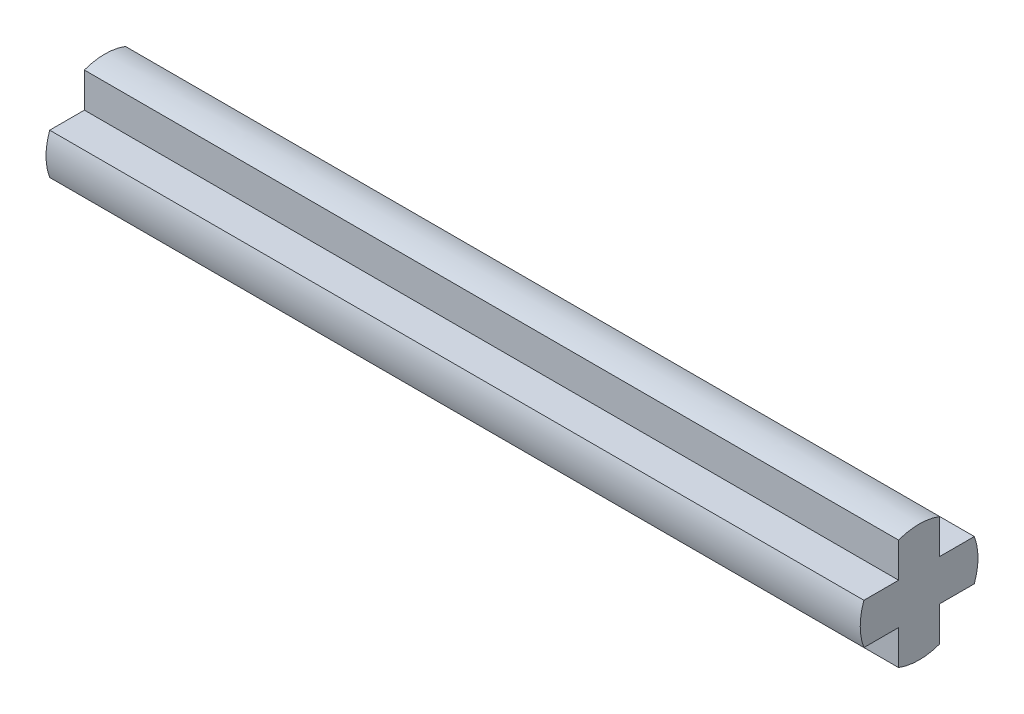
ISO-10303-21;
HEADER;
FILE_DESCRIPTION(('STEP AP214'),'2;1');
FILE_NAME('part.step','',(''),(''),'','','');
FILE_SCHEMA(('AUTOMOTIVE_DESIGN { 1 0 10303 214 1 1 1 1 }'));
ENDSEC;
DATA;
#1=APPLICATION_CONTEXT('core data for automotive mechanical design processes');
#2=APPLICATION_PROTOCOL_DEFINITION('international standard','automotive_design',2000,#1);
#3=PRODUCT_CONTEXT('',#1,'mechanical');
#4=PRODUCT('Part','Part','',(#3));
#5=PRODUCT_RELATED_PRODUCT_CATEGORY('part','',(#4));
#6=PRODUCT_DEFINITION_FORMATION('','',#4);
#7=PRODUCT_DEFINITION_CONTEXT('part definition',#1,'design');
#8=PRODUCT_DEFINITION('design','',#6,#7);
#9=PRODUCT_DEFINITION_SHAPE('','',#8);
#10=(LENGTH_UNIT() NAMED_UNIT(*) SI_UNIT(.MILLI.,.METRE.));
#11=(NAMED_UNIT(*) PLANE_ANGLE_UNIT() SI_UNIT($,.RADIAN.));
#12=(NAMED_UNIT(*) SI_UNIT($,.STERADIAN.) SOLID_ANGLE_UNIT());
#13=UNCERTAINTY_MEASURE_WITH_UNIT(LENGTH_MEASURE(1.E-05),#10,'distance_accuracy_value','');
#14=(GEOMETRIC_REPRESENTATION_CONTEXT(3) GLOBAL_UNCERTAINTY_ASSIGNED_CONTEXT((#13)) GLOBAL_UNIT_ASSIGNED_CONTEXT((#10,
#11,#12)) REPRESENTATION_CONTEXT('',''));
#15=CARTESIAN_POINT('',(0.,0.,0.));
#16=DIRECTION('',(0.,0.,1.));
#17=DIRECTION('',(1.,0.,0.));
#18=AXIS2_PLACEMENT_3D('',#15,#16,#17);
#19=CARTESIAN_POINT('',(31.8,0.8,2.15638586528478));
#20=CARTESIAN_POINT('',(31.8,0.,2.44361413471522));
#21=CARTESIAN_POINT('',(31.8,-0.8,2.15638586528478));
#22=B_SPLINE_CURVE_WITH_KNOTS('',2,(#19,#20,#21),.UNSPECIFIED.,.F.,.F.,(3,3),(0.,1.),.UNSPECIFIED.);
#23=DIRECTION('',(-1.,0.,0.));
#24=VECTOR('',#23,1.);
#25=SURFACE_OF_LINEAR_EXTRUSION('',#22,#24);
#26=CARTESIAN_POINT('',(0.,0.8,2.15638586528478));
#27=CARTESIAN_POINT('',(0.,0.,2.44361413471522));
#28=CARTESIAN_POINT('',(0.,-0.8,2.15638586528478));
#29=B_SPLINE_CURVE_WITH_KNOTS('',2,(#26,#27,#28),.UNSPECIFIED.,.F.,.F.,(3,3),(0.,1.),.UNSPECIFIED.);
#30=CARTESIAN_POINT('',(0.,0.8,2.15638586528478));
#31=VERTEX_POINT('',#30);
#32=CARTESIAN_POINT('',(0.,-0.8,2.15638586528478));
#33=VERTEX_POINT('',#32);
#34=EDGE_CURVE('E157',#31,#33,#29,.T.);
#35=ORIENTED_EDGE('',*,*,#34,.T.);
#36=DIRECTION('',(-1.,0.,0.));
#37=VECTOR('',#36,1.);
#38=CARTESIAN_POINT('',(31.8,-0.8,2.15638586528478));
#39=LINE('',#38,#37);
#40=CARTESIAN_POINT('',(31.8,-0.8,2.15638586528478));
#41=VERTEX_POINT('',#40);
#42=EDGE_CURVE('E11',#41,#33,#39,.T.);
#43=ORIENTED_EDGE('',*,*,#42,.F.);
#44=CARTESIAN_POINT('',(31.8,0.8,2.15638586528478));
#45=VERTEX_POINT('',#44);
#46=EDGE_CURVE('E199',#45,#41,#22,.T.);
#47=ORIENTED_EDGE('',*,*,#46,.F.);
#48=DIRECTION('',(-1.,0.,0.));
#49=VECTOR('',#48,1.);
#50=CARTESIAN_POINT('',(31.8,0.8,2.15638586528478));
#51=LINE('',#50,#49);
#52=EDGE_CURVE('E150',#45,#31,#51,.T.);
#53=ORIENTED_EDGE('',*,*,#52,.T.);
#54=EDGE_LOOP('',(#35,#43,#47,#53));
#55=FACE_BOUND('',#54,.T.);
#56=ADVANCED_FACE('F33',(#55),#25,.F.);
#57=CARTESIAN_POINT('',(31.8,-0.8,0.8));
#58=DIRECTION('',(0.,1.,0.));
#59=DIRECTION('',(0.,0.,1.));
#60=AXIS2_PLACEMENT_3D('',#57,#58,#59);
#61=PLANE('',#60);
#62=DIRECTION('',(0.,0.,-1.));
#63=VECTOR('',#62,1.);
#64=CARTESIAN_POINT('',(0.,-0.8,0.8));
#65=LINE('',#64,#63);
#66=CARTESIAN_POINT('',(0.,-0.8,0.8));
#67=VERTEX_POINT('',#66);
#68=EDGE_CURVE('E162',#33,#67,#65,.T.);
#69=ORIENTED_EDGE('',*,*,#68,.T.);
#70=DIRECTION('',(-1.,0.,0.));
#71=VECTOR('',#70,1.);
#72=CARTESIAN_POINT('',(31.8,-0.8,0.8));
#73=LINE('',#72,#71);
#74=CARTESIAN_POINT('',(31.8,-0.8,0.8));
#75=VERTEX_POINT('',#74);
#76=EDGE_CURVE('E42',#75,#67,#73,.T.);
#77=ORIENTED_EDGE('',*,*,#76,.F.);
#78=DIRECTION('',(0.,0.,-1.));
#79=VECTOR('',#78,1.);
#80=CARTESIAN_POINT('',(31.8,-0.8,0.8));
#81=LINE('',#80,#79);
#82=EDGE_CURVE('E105',#41,#75,#81,.T.);
#83=ORIENTED_EDGE('',*,*,#82,.F.);
#84=ORIENTED_EDGE('',*,*,#42,.T.);
#85=EDGE_LOOP('',(#69,#77,#83,#84));
#86=FACE_BOUND('',#85,.T.);
#87=ADVANCED_FACE('F279',(#86),#61,.F.);
#88=CARTESIAN_POINT('',(31.8,-2.15638586528478,0.8));
#89=DIRECTION('',(0.,0.,-1.));
#90=DIRECTION('',(-1.,0.,0.));
#91=AXIS2_PLACEMENT_3D('',#88,#89,#90);
#92=PLANE('',#91);
#93=DIRECTION('',(0.,-1.,0.));
#94=VECTOR('',#93,1.);
#95=CARTESIAN_POINT('',(0.,-2.15638586528478,0.8));
#96=LINE('',#95,#94);
#97=CARTESIAN_POINT('',(0.,-2.15638586528478,0.8));
#98=VERTEX_POINT('',#97);
#99=EDGE_CURVE('E167',#67,#98,#96,.T.);
#100=ORIENTED_EDGE('',*,*,#99,.T.);
#101=DIRECTION('',(-1.,0.,0.));
#102=VECTOR('',#101,1.);
#103=CARTESIAN_POINT('',(31.8,-2.15638586528478,0.8));
#104=LINE('',#103,#102);
#105=CARTESIAN_POINT('',(31.8,-2.15638586528478,0.8));
#106=VERTEX_POINT('',#105);
#107=EDGE_CURVE('E218',#106,#98,#104,.T.);
#108=ORIENTED_EDGE('',*,*,#107,.F.);
#109=DIRECTION('',(0.,-1.,0.));
#110=VECTOR('',#109,1.);
#111=CARTESIAN_POINT('',(31.8,-2.15638586528478,0.8));
#112=LINE('',#111,#110);
#113=EDGE_CURVE('E226',#75,#106,#112,.T.);
#114=ORIENTED_EDGE('',*,*,#113,.F.);
#115=ORIENTED_EDGE('',*,*,#76,.T.);
#116=EDGE_LOOP('',(#100,#108,#114,#115));
#117=FACE_BOUND('',#116,.T.);
#118=ADVANCED_FACE('F224',(#117),#92,.F.);
#119=CARTESIAN_POINT('',(31.8,-2.15638586528478,0.8));
#120=CARTESIAN_POINT('',(31.8,-2.44361413471522,0.));
#121=CARTESIAN_POINT('',(31.8,-2.15638586528478,-0.8));
#122=B_SPLINE_CURVE_WITH_KNOTS('',2,(#119,#120,#121),.UNSPECIFIED.,.F.,.F.,(3,3),(0.,1.),.UNSPECIFIED.);
#123=DIRECTION('',(-1.,0.,0.));
#124=VECTOR('',#123,1.);
#125=SURFACE_OF_LINEAR_EXTRUSION('',#122,#124);
#126=CARTESIAN_POINT('',(0.,-2.15638586528478,0.8));
#127=CARTESIAN_POINT('',(0.,-2.44361413471522,0.));
#128=CARTESIAN_POINT('',(0.,-2.15638586528478,-0.8));
#129=B_SPLINE_CURVE_WITH_KNOTS('',2,(#126,#127,#128),.UNSPECIFIED.,.F.,.F.,(3,3),(0.,1.),.UNSPECIFIED.);
#130=CARTESIAN_POINT('',(0.,-2.15638586528478,-0.8));
#131=VERTEX_POINT('',#130);
#132=EDGE_CURVE('E169',#98,#131,#129,.T.);
#133=ORIENTED_EDGE('',*,*,#132,.T.);
#134=DIRECTION('',(-1.,0.,0.));
#135=VECTOR('',#134,1.);
#136=CARTESIAN_POINT('',(31.8,-2.15638586528478,-0.8));
#137=LINE('',#136,#135);
#138=CARTESIAN_POINT('',(31.8,-2.15638586528478,-0.8));
#139=VERTEX_POINT('',#138);
#140=EDGE_CURVE('E215',#139,#131,#137,.T.);
#141=ORIENTED_EDGE('',*,*,#140,.F.);
#142=EDGE_CURVE('E244',#106,#139,#122,.T.);
#143=ORIENTED_EDGE('',*,*,#142,.F.);
#144=ORIENTED_EDGE('',*,*,#107,.T.);
#145=EDGE_LOOP('',(#133,#141,#143,#144));
#146=FACE_BOUND('',#145,.T.);
#147=ADVANCED_FACE('F235',(#146),#125,.F.);
#148=CARTESIAN_POINT('',(31.8,-0.8,-0.8));
#149=DIRECTION('',(0.,0.,1.));
#150=DIRECTION('',(0.,-1.,0.));
#151=AXIS2_PLACEMENT_3D('',#148,#149,#150);
#152=PLANE('',#151);
#153=DIRECTION('',(0.,1.,0.));
#154=VECTOR('',#153,1.);
#155=CARTESIAN_POINT('',(0.,-0.8,-0.8));
#156=LINE('',#155,#154);
#157=CARTESIAN_POINT('',(0.,-0.8,-0.8));
#158=VERTEX_POINT('',#157);
#159=EDGE_CURVE('E173',#131,#158,#156,.T.);
#160=ORIENTED_EDGE('',*,*,#159,.T.);
#161=DIRECTION('',(-1.,0.,0.));
#162=VECTOR('',#161,1.);
#163=CARTESIAN_POINT('',(31.8,-0.8,-0.8));
#164=LINE('',#163,#162);
#165=CARTESIAN_POINT('',(31.8,-0.8,-0.8));
#166=VERTEX_POINT('',#165);
#167=EDGE_CURVE('E212',#166,#158,#164,.T.);
#168=ORIENTED_EDGE('',*,*,#167,.F.);
#169=DIRECTION('',(0.,1.,0.));
#170=VECTOR('',#169,1.);
#171=CARTESIAN_POINT('',(31.8,-0.8,-0.8));
#172=LINE('',#171,#170);
#173=EDGE_CURVE('E241',#139,#166,#172,.T.);
#174=ORIENTED_EDGE('',*,*,#173,.F.);
#175=ORIENTED_EDGE('',*,*,#140,.T.);
#176=EDGE_LOOP('',(#160,#168,#174,#175));
#177=FACE_BOUND('',#176,.T.);
#178=ADVANCED_FACE('F239',(#177),#152,.F.);
#179=CARTESIAN_POINT('',(31.8,-0.8,-2.15638586528478));
#180=DIRECTION('',(0.,1.,0.));
#181=DIRECTION('',(0.,0.,1.));
#182=AXIS2_PLACEMENT_3D('',#179,#180,#181);
#183=PLANE('',#182);
#184=DIRECTION('',(0.,0.,-1.));
#185=VECTOR('',#184,1.);
#186=CARTESIAN_POINT('',(0.,-0.8,-2.15638586528478));
#187=LINE('',#186,#185);
#188=CARTESIAN_POINT('',(0.,-0.8,-2.15638586528478));
#189=VERTEX_POINT('',#188);
#190=EDGE_CURVE('E178',#158,#189,#187,.T.);
#191=ORIENTED_EDGE('',*,*,#190,.T.);
#192=DIRECTION('',(-1.,0.,0.));
#193=VECTOR('',#192,1.);
#194=CARTESIAN_POINT('',(31.8,-0.8,-2.15638586528478));
#195=LINE('',#194,#193);
#196=CARTESIAN_POINT('',(31.8,-0.8,-2.15638586528478));
#197=VERTEX_POINT('',#196);
#198=EDGE_CURVE('E209',#197,#189,#195,.T.);
#199=ORIENTED_EDGE('',*,*,#198,.F.);
#200=DIRECTION('',(0.,0.,-1.));
#201=VECTOR('',#200,1.);
#202=CARTESIAN_POINT('',(31.8,-0.8,-2.15638586528478));
#203=LINE('',#202,#201);
#204=EDGE_CURVE('E243',#166,#197,#203,.T.);
#205=ORIENTED_EDGE('',*,*,#204,.F.);
#206=ORIENTED_EDGE('',*,*,#167,.T.);
#207=EDGE_LOOP('',(#191,#199,#205,#206));
#208=FACE_BOUND('',#207,.T.);
#209=ADVANCED_FACE('F268',(#208),#183,.F.);
#210=CARTESIAN_POINT('',(31.8,-0.8,-2.15638586528478));
#211=CARTESIAN_POINT('',(31.8,0.,-2.44361413471522));
#212=CARTESIAN_POINT('',(31.8,0.8,-2.15638586528478));
#213=B_SPLINE_CURVE_WITH_KNOTS('',2,(#210,#211,#212),.UNSPECIFIED.,.F.,.F.,(3,3),(0.,1.),.UNSPECIFIED.);
#214=DIRECTION('',(-1.,0.,0.));
#215=VECTOR('',#214,1.);
#216=SURFACE_OF_LINEAR_EXTRUSION('',#213,#215);
#217=CARTESIAN_POINT('',(0.,-0.8,-2.15638586528478));
#218=CARTESIAN_POINT('',(0.,0.,-2.44361413471522));
#219=CARTESIAN_POINT('',(0.,0.8,-2.15638586528478));
#220=B_SPLINE_CURVE_WITH_KNOTS('',2,(#217,#218,#219),.UNSPECIFIED.,.F.,.F.,(3,3),(0.,1.),.UNSPECIFIED.);
#221=CARTESIAN_POINT('',(0.,0.8,-2.15638586528478));
#222=VERTEX_POINT('',#221);
#223=EDGE_CURVE('E180',#189,#222,#220,.T.);
#224=ORIENTED_EDGE('',*,*,#223,.T.);
#225=DIRECTION('',(-1.,0.,0.));
#226=VECTOR('',#225,1.);
#227=CARTESIAN_POINT('',(31.8,0.8,-2.15638586528478));
#228=LINE('',#227,#226);
#229=CARTESIAN_POINT('',(31.8,0.8,-2.15638586528478));
#230=VERTEX_POINT('',#229);
#231=EDGE_CURVE('E206',#230,#222,#228,.T.);
#232=ORIENTED_EDGE('',*,*,#231,.F.);
#233=EDGE_CURVE('E246',#197,#230,#213,.T.);
#234=ORIENTED_EDGE('',*,*,#233,.F.);
#235=ORIENTED_EDGE('',*,*,#198,.T.);
#236=EDGE_LOOP('',(#224,#232,#234,#235));
#237=FACE_BOUND('',#236,.T.);
#238=ADVANCED_FACE('F263',(#237),#216,.F.);
#239=CARTESIAN_POINT('',(31.8,0.8,-0.8));
#240=DIRECTION('',(0.,-1.,0.));
#241=DIRECTION('',(0.,0.,-1.));
#242=AXIS2_PLACEMENT_3D('',#239,#240,#241);
#243=PLANE('',#242);
#244=DIRECTION('',(0.,0.,1.));
#245=VECTOR('',#244,1.);
#246=CARTESIAN_POINT('',(0.,0.8,-0.8));
#247=LINE('',#246,#245);
#248=CARTESIAN_POINT('',(0.,0.8,-0.8));
#249=VERTEX_POINT('',#248);
#250=EDGE_CURVE('E184',#222,#249,#247,.T.);
#251=ORIENTED_EDGE('',*,*,#250,.T.);
#252=DIRECTION('',(-1.,0.,0.));
#253=VECTOR('',#252,1.);
#254=CARTESIAN_POINT('',(31.8,0.8,-0.8));
#255=LINE('',#254,#253);
#256=CARTESIAN_POINT('',(31.8,0.8,-0.8));
#257=VERTEX_POINT('',#256);
#258=EDGE_CURVE('E203',#257,#249,#255,.T.);
#259=ORIENTED_EDGE('',*,*,#258,.F.);
#260=DIRECTION('',(0.,0.,1.));
#261=VECTOR('',#260,1.);
#262=CARTESIAN_POINT('',(31.8,0.8,-0.8));
#263=LINE('',#262,#261);
#264=EDGE_CURVE('E258',#230,#257,#263,.T.);
#265=ORIENTED_EDGE('',*,*,#264,.F.);
#266=ORIENTED_EDGE('',*,*,#231,.T.);
#267=EDGE_LOOP('',(#251,#259,#265,#266));
#268=FACE_BOUND('',#267,.T.);
#269=ADVANCED_FACE('F267',(#268),#243,.F.);
#270=CARTESIAN_POINT('',(31.8,2.15638586528478,-0.8));
#271=DIRECTION('',(0.,0.,1.));
#272=DIRECTION('',(1.,0.,0.));
#273=AXIS2_PLACEMENT_3D('',#270,#271,#272);
#274=PLANE('',#273);
#275=DIRECTION('',(0.,1.,0.));
#276=VECTOR('',#275,1.);
#277=CARTESIAN_POINT('',(0.,2.15638586528478,-0.8));
#278=LINE('',#277,#276);
#279=CARTESIAN_POINT('',(0.,2.15638586528478,-0.8));
#280=VERTEX_POINT('',#279);
#281=EDGE_CURVE('E189',#249,#280,#278,.T.);
#282=ORIENTED_EDGE('',*,*,#281,.T.);
#283=DIRECTION('',(-1.,0.,0.));
#284=VECTOR('',#283,1.);
#285=CARTESIAN_POINT('',(31.8,2.15638586528478,-0.8));
#286=LINE('',#285,#284);
#287=CARTESIAN_POINT('',(31.8,2.15638586528478,-0.8));
#288=VERTEX_POINT('',#287);
#289=EDGE_CURVE('E145',#288,#280,#286,.T.);
#290=ORIENTED_EDGE('',*,*,#289,.F.);
#291=DIRECTION('',(0.,1.,0.));
#292=VECTOR('',#291,1.);
#293=CARTESIAN_POINT('',(31.8,2.15638586528478,-0.8));
#294=LINE('',#293,#292);
#295=EDGE_CURVE('E136',#257,#288,#294,.T.);
#296=ORIENTED_EDGE('',*,*,#295,.F.);
#297=ORIENTED_EDGE('',*,*,#258,.T.);
#298=EDGE_LOOP('',(#282,#290,#296,#297));
#299=FACE_BOUND('',#298,.T.);
#300=ADVANCED_FACE('F291',(#299),#274,.F.);
#301=CARTESIAN_POINT('',(31.8,2.15638586528478,-0.8));
#302=CARTESIAN_POINT('',(31.8,2.44361413471522,0.));
#303=CARTESIAN_POINT('',(31.8,2.15638586528478,0.8));
#304=B_SPLINE_CURVE_WITH_KNOTS('',2,(#301,#302,#303),.UNSPECIFIED.,.F.,.F.,(3,3),(0.,1.),.UNSPECIFIED.);
#305=DIRECTION('',(-1.,0.,0.));
#306=VECTOR('',#305,1.);
#307=SURFACE_OF_LINEAR_EXTRUSION('',#304,#306);
#308=CARTESIAN_POINT('',(0.,2.15638586528478,-0.8));
#309=CARTESIAN_POINT('',(0.,2.44361413471522,0.));
#310=CARTESIAN_POINT('',(0.,2.15638586528478,0.8));
#311=B_SPLINE_CURVE_WITH_KNOTS('',2,(#308,#309,#310),.UNSPECIFIED.,.F.,.F.,(3,3),(0.,1.),.UNSPECIFIED.);
#312=CARTESIAN_POINT('',(0.,2.15638586528478,0.8));
#313=VERTEX_POINT('',#312);
#314=EDGE_CURVE('E144',#280,#313,#311,.T.);
#315=ORIENTED_EDGE('',*,*,#314,.T.);
#316=DIRECTION('',(-1.,0.,0.));
#317=VECTOR('',#316,1.);
#318=CARTESIAN_POINT('',(31.8,2.15638586528478,0.8));
#319=LINE('',#318,#317);
#320=CARTESIAN_POINT('',(31.8,2.15638586528478,0.8));
#321=VERTEX_POINT('',#320);
#322=EDGE_CURVE('E141',#321,#313,#319,.T.);
#323=ORIENTED_EDGE('',*,*,#322,.F.);
#324=EDGE_CURVE('E130',#288,#321,#304,.T.);
#325=ORIENTED_EDGE('',*,*,#324,.F.);
#326=ORIENTED_EDGE('',*,*,#289,.T.);
#327=EDGE_LOOP('',(#315,#323,#325,#326));
#328=FACE_BOUND('',#327,.T.);
#329=ADVANCED_FACE('F142',(#328),#307,.F.);
#330=CARTESIAN_POINT('',(31.8,0.8,0.8));
#331=DIRECTION('',(0.,0.,-1.));
#332=DIRECTION('',(-1.,0.,0.));
#333=AXIS2_PLACEMENT_3D('',#330,#331,#332);
#334=PLANE('',#333);
#335=DIRECTION('',(0.,-1.,0.));
#336=VECTOR('',#335,1.);
#337=CARTESIAN_POINT('',(0.,0.8,0.8));
#338=LINE('',#337,#336);
#339=CARTESIAN_POINT('',(0.,0.8,0.8));
#340=VERTEX_POINT('',#339);
#341=EDGE_CURVE('E91',#313,#340,#338,.T.);
#342=ORIENTED_EDGE('',*,*,#341,.T.);
#343=DIRECTION('',(-1.,0.,0.));
#344=VECTOR('',#343,1.);
#345=CARTESIAN_POINT('',(31.8,0.8,0.8));
#346=LINE('',#345,#344);
#347=CARTESIAN_POINT('',(31.8,0.8,0.8));
#348=VERTEX_POINT('',#347);
#349=EDGE_CURVE('E146',#348,#340,#346,.T.);
#350=ORIENTED_EDGE('',*,*,#349,.F.);
#351=DIRECTION('',(0.,-1.,0.));
#352=VECTOR('',#351,1.);
#353=CARTESIAN_POINT('',(31.8,0.8,0.8));
#354=LINE('',#353,#352);
#355=EDGE_CURVE('E134',#321,#348,#354,.T.);
#356=ORIENTED_EDGE('',*,*,#355,.F.);
#357=ORIENTED_EDGE('',*,*,#322,.T.);
#358=EDGE_LOOP('',(#342,#350,#356,#357));
#359=FACE_BOUND('',#358,.T.);
#360=ADVANCED_FACE('F148',(#359),#334,.F.);
#361=CARTESIAN_POINT('',(31.8,0.8,2.15638586528478));
#362=DIRECTION('',(0.,-1.,0.));
#363=DIRECTION('',(0.,0.,-1.));
#364=AXIS2_PLACEMENT_3D('',#361,#362,#363);
#365=PLANE('',#364);
#366=DIRECTION('',(0.,0.,1.));
#367=VECTOR('',#366,1.);
#368=CARTESIAN_POINT('',(0.,0.8,2.15638586528478));
#369=LINE('',#368,#367);
#370=EDGE_CURVE('E97',#340,#31,#369,.T.);
#371=ORIENTED_EDGE('',*,*,#370,.T.);
#372=ORIENTED_EDGE('',*,*,#52,.F.);
#373=DIRECTION('',(0.,0.,1.));
#374=VECTOR('',#373,1.);
#375=CARTESIAN_POINT('',(31.8,0.8,2.15638586528478));
#376=LINE('',#375,#374);
#377=EDGE_CURVE('E50',#348,#45,#376,.T.);
#378=ORIENTED_EDGE('',*,*,#377,.F.);
#379=ORIENTED_EDGE('',*,*,#349,.T.);
#380=EDGE_LOOP('',(#371,#372,#378,#379));
#381=FACE_BOUND('',#380,.T.);
#382=ADVANCED_FACE('F309',(#381),#365,.F.);
#383=CARTESIAN_POINT('',(31.8,0.,2.3));
#384=DIRECTION('',(1.,0.,0.));
#385=DIRECTION('',(0.,0.,-1.));
#386=AXIS2_PLACEMENT_3D('',#383,#384,#385);
#387=PLANE('',#386);
#388=ORIENTED_EDGE('',*,*,#46,.T.);
#389=ORIENTED_EDGE('',*,*,#82,.T.);
#390=ORIENTED_EDGE('',*,*,#113,.T.);
#391=ORIENTED_EDGE('',*,*,#142,.T.);
#392=ORIENTED_EDGE('',*,*,#173,.T.);
#393=ORIENTED_EDGE('',*,*,#204,.T.);
#394=ORIENTED_EDGE('',*,*,#233,.T.);
#395=ORIENTED_EDGE('',*,*,#264,.T.);
#396=ORIENTED_EDGE('',*,*,#295,.T.);
#397=ORIENTED_EDGE('',*,*,#324,.T.);
#398=ORIENTED_EDGE('',*,*,#355,.T.);
#399=ORIENTED_EDGE('',*,*,#377,.T.);
#400=EDGE_LOOP('',(#388,#389,#390,#391,#392,#393,#394,#395,#396,#397,#398,#399));
#401=FACE_BOUND('',#400,.T.);
#402=ADVANCED_FACE('F132',(#401),#387,.T.);
#403=CARTESIAN_POINT('',(0.,0.,2.3));
#404=DIRECTION('',(1.,0.,0.));
#405=DIRECTION('',(0.,0.,-1.));
#406=AXIS2_PLACEMENT_3D('',#403,#404,#405);
#407=PLANE('',#406);
#408=ORIENTED_EDGE('',*,*,#34,.F.);
#409=ORIENTED_EDGE('',*,*,#370,.F.);
#410=ORIENTED_EDGE('',*,*,#341,.F.);
#411=ORIENTED_EDGE('',*,*,#314,.F.);
#412=ORIENTED_EDGE('',*,*,#281,.F.);
#413=ORIENTED_EDGE('',*,*,#250,.F.);
#414=ORIENTED_EDGE('',*,*,#223,.F.);
#415=ORIENTED_EDGE('',*,*,#190,.F.);
#416=ORIENTED_EDGE('',*,*,#159,.F.);
#417=ORIENTED_EDGE('',*,*,#132,.F.);
#418=ORIENTED_EDGE('',*,*,#99,.F.);
#419=ORIENTED_EDGE('',*,*,#68,.F.);
#420=EDGE_LOOP('',(#408,#409,#410,#411,#412,#413,#414,#415,#416,#417,#418,#419));
#421=FACE_BOUND('',#420,.T.);
#422=ADVANCED_FACE('F230',(#421),#407,.F.);
#423=CLOSED_SHELL('',(#56,#87,#118,#147,#178,#209,#238,#269,#300,#329,#360,#382,#402,#422));
#424=MANIFOLD_SOLID_BREP('B2',#423);
#425=ADVANCED_BREP_SHAPE_REPRESENTATION('',(#18,#424),#14);
#426=SHAPE_DEFINITION_REPRESENTATION(#9,#425);
ENDSEC;
END-ISO-10303-21;
